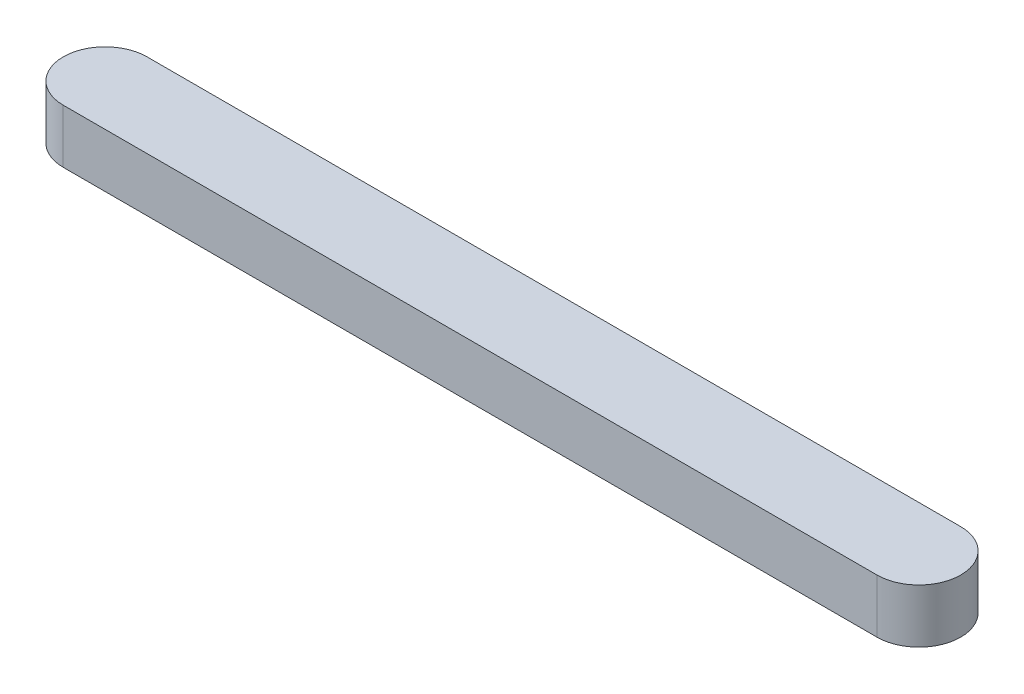
ISO-10303-21;
HEADER;
FILE_DESCRIPTION(('STEP AP214'),'2;1');
FILE_NAME('part.step','',(''),(''),'','','');
FILE_SCHEMA(('AUTOMOTIVE_DESIGN { 1 0 10303 214 1 1 1 1 }'));
ENDSEC;
DATA;
#1=APPLICATION_CONTEXT('core data for automotive mechanical design processes');
#2=APPLICATION_PROTOCOL_DEFINITION('international standard','automotive_design',2000,#1);
#3=PRODUCT_CONTEXT('',#1,'mechanical');
#4=PRODUCT('Part','Part','',(#3));
#5=PRODUCT_RELATED_PRODUCT_CATEGORY('part','',(#4));
#6=PRODUCT_DEFINITION_FORMATION('','',#4);
#7=PRODUCT_DEFINITION_CONTEXT('part definition',#1,'design');
#8=PRODUCT_DEFINITION('design','',#6,#7);
#9=PRODUCT_DEFINITION_SHAPE('','',#8);
#10=(LENGTH_UNIT() NAMED_UNIT(*) SI_UNIT(.MILLI.,.METRE.));
#11=(NAMED_UNIT(*) PLANE_ANGLE_UNIT() SI_UNIT($,.RADIAN.));
#12=(NAMED_UNIT(*) SI_UNIT($,.STERADIAN.) SOLID_ANGLE_UNIT());
#13=UNCERTAINTY_MEASURE_WITH_UNIT(LENGTH_MEASURE(1.E-05),#10,'distance_accuracy_value','');
#14=(GEOMETRIC_REPRESENTATION_CONTEXT(3) GLOBAL_UNCERTAINTY_ASSIGNED_CONTEXT((#13)) GLOBAL_UNIT_ASSIGNED_CONTEXT((#10,
#11,#12)) REPRESENTATION_CONTEXT('',''));
#15=CARTESIAN_POINT('',(0.,0.,0.));
#16=DIRECTION('',(0.,0.,1.));
#17=DIRECTION('',(1.,0.,0.));
#18=AXIS2_PLACEMENT_3D('',#15,#16,#17);
#19=CARTESIAN_POINT('',(-68.,9.,0.));
#20=DIRECTION('',(0.,-1.,0.));
#21=DIRECTION('',(0.,0.,-1.));
#22=AXIS2_PLACEMENT_3D('',#19,#20,#21);
#23=CYLINDRICAL_SURFACE('',#22,7.);
#24=CARTESIAN_POINT('',(-68.,0.,0.));
#25=DIRECTION('',(0.,1.,0.));
#26=DIRECTION('',(0.,0.,1.));
#27=AXIS2_PLACEMENT_3D('',#24,#25,#26);
#28=CIRCLE('',#27,7.);
#29=CARTESIAN_POINT('',(-68.,0.,-7.));
#30=VERTEX_POINT('',#29);
#31=CARTESIAN_POINT('',(-68.,0.,7.));
#32=VERTEX_POINT('',#31);
#33=EDGE_CURVE('E104',#30,#32,#28,.T.);
#34=ORIENTED_EDGE('',*,*,#33,.T.);
#35=DIRECTION('',(0.,-1.,0.));
#36=VECTOR('',#35,1.);
#37=CARTESIAN_POINT('',(-68.,9.,7.));
#38=LINE('',#37,#36);
#39=CARTESIAN_POINT('',(-68.,9.,7.));
#40=VERTEX_POINT('',#39);
#41=EDGE_CURVE('E11',#40,#32,#38,.T.);
#42=ORIENTED_EDGE('',*,*,#41,.F.);
#43=CARTESIAN_POINT('',(-68.,9.,0.));
#44=DIRECTION('',(0.,1.,0.));
#45=DIRECTION('',(0.,0.,1.));
#46=AXIS2_PLACEMENT_3D('',#43,#44,#45);
#47=CIRCLE('',#46,7.);
#48=CARTESIAN_POINT('',(-68.,9.,-7.));
#49=VERTEX_POINT('',#48);
#50=EDGE_CURVE('E92',#49,#40,#47,.T.);
#51=ORIENTED_EDGE('',*,*,#50,.F.);
#52=DIRECTION('',(0.,-1.,0.));
#53=VECTOR('',#52,1.);
#54=CARTESIAN_POINT('',(-68.,9.,-7.));
#55=LINE('',#54,#53);
#56=EDGE_CURVE('E100',#49,#30,#55,.T.);
#57=ORIENTED_EDGE('',*,*,#56,.T.);
#58=EDGE_LOOP('',(#34,#42,#51,#57));
#59=FACE_BOUND('',#58,.T.);
#60=ADVANCED_FACE('F41',(#59),#23,.T.);
#61=CARTESIAN_POINT('',(-68.,9.,7.));
#62=DIRECTION('',(0.,0.,-1.));
#63=DIRECTION('',(-1.,0.,0.));
#64=AXIS2_PLACEMENT_3D('',#61,#62,#63);
#65=PLANE('',#64);
#66=DIRECTION('',(1.,0.,0.));
#67=VECTOR('',#66,1.);
#68=CARTESIAN_POINT('',(-68.,0.,7.));
#69=LINE('',#68,#67);
#70=CARTESIAN_POINT('',(68.,0.,7.));
#71=VERTEX_POINT('',#70);
#72=EDGE_CURVE('E96',#32,#71,#69,.T.);
#73=ORIENTED_EDGE('',*,*,#72,.T.);
#74=DIRECTION('',(0.,-1.,0.));
#75=VECTOR('',#74,1.);
#76=CARTESIAN_POINT('',(68.,9.,7.));
#77=LINE('',#76,#75);
#78=CARTESIAN_POINT('',(68.,9.,7.));
#79=VERTEX_POINT('',#78);
#80=EDGE_CURVE('E49',#79,#71,#77,.T.);
#81=ORIENTED_EDGE('',*,*,#80,.F.);
#82=DIRECTION('',(1.,0.,0.));
#83=VECTOR('',#82,1.);
#84=CARTESIAN_POINT('',(-68.,9.,7.));
#85=LINE('',#84,#83);
#86=EDGE_CURVE('E87',#40,#79,#85,.T.);
#87=ORIENTED_EDGE('',*,*,#86,.F.);
#88=ORIENTED_EDGE('',*,*,#41,.T.);
#89=EDGE_LOOP('',(#73,#81,#87,#88));
#90=FACE_BOUND('',#89,.T.);
#91=ADVANCED_FACE('F95',(#90),#65,.F.);
#92=CARTESIAN_POINT('',(68.,9.,0.));
#93=DIRECTION('',(0.,-1.,0.));
#94=DIRECTION('',(0.,0.,-1.));
#95=AXIS2_PLACEMENT_3D('',#92,#93,#94);
#96=CYLINDRICAL_SURFACE('',#95,7.);
#97=CARTESIAN_POINT('',(68.,0.,0.));
#98=DIRECTION('',(0.,1.,0.));
#99=DIRECTION('',(0.,0.,1.));
#100=AXIS2_PLACEMENT_3D('',#97,#98,#99);
#101=CIRCLE('',#100,7.);
#102=CARTESIAN_POINT('',(68.,0.,-7.));
#103=VERTEX_POINT('',#102);
#104=EDGE_CURVE('E74',#71,#103,#101,.T.);
#105=ORIENTED_EDGE('',*,*,#104,.T.);
#106=DIRECTION('',(0.,-1.,0.));
#107=VECTOR('',#106,1.);
#108=CARTESIAN_POINT('',(68.,9.,-7.));
#109=LINE('',#108,#107);
#110=CARTESIAN_POINT('',(68.,9.,-7.));
#111=VERTEX_POINT('',#110);
#112=EDGE_CURVE('E97',#111,#103,#109,.T.);
#113=ORIENTED_EDGE('',*,*,#112,.F.);
#114=CARTESIAN_POINT('',(68.,9.,0.));
#115=DIRECTION('',(0.,1.,0.));
#116=DIRECTION('',(0.,0.,1.));
#117=AXIS2_PLACEMENT_3D('',#114,#115,#116);
#118=CIRCLE('',#117,7.);
#119=EDGE_CURVE('E90',#79,#111,#118,.T.);
#120=ORIENTED_EDGE('',*,*,#119,.F.);
#121=ORIENTED_EDGE('',*,*,#80,.T.);
#122=EDGE_LOOP('',(#105,#113,#120,#121));
#123=FACE_BOUND('',#122,.T.);
#124=ADVANCED_FACE('F98',(#123),#96,.T.);
#125=CARTESIAN_POINT('',(-68.,9.,-7.));
#126=DIRECTION('',(0.,0.,1.));
#127=DIRECTION('',(1.,0.,0.));
#128=AXIS2_PLACEMENT_3D('',#125,#126,#127);
#129=PLANE('',#128);
#130=DIRECTION('',(-1.,0.,0.));
#131=VECTOR('',#130,1.);
#132=CARTESIAN_POINT('',(-68.,0.,-7.));
#133=LINE('',#132,#131);
#134=EDGE_CURVE('E80',#103,#30,#133,.T.);
#135=ORIENTED_EDGE('',*,*,#134,.T.);
#136=ORIENTED_EDGE('',*,*,#56,.F.);
#137=DIRECTION('',(-1.,0.,0.));
#138=VECTOR('',#137,1.);
#139=CARTESIAN_POINT('',(-68.,9.,-7.));
#140=LINE('',#139,#138);
#141=EDGE_CURVE('E57',#111,#49,#140,.T.);
#142=ORIENTED_EDGE('',*,*,#141,.F.);
#143=ORIENTED_EDGE('',*,*,#112,.T.);
#144=EDGE_LOOP('',(#135,#136,#142,#143));
#145=FACE_BOUND('',#144,.T.);
#146=ADVANCED_FACE('F111',(#145),#129,.F.);
#147=CARTESIAN_POINT('',(-68.,9.,0.));
#148=DIRECTION('',(0.,1.,0.));
#149=DIRECTION('',(0.,0.,1.));
#150=AXIS2_PLACEMENT_3D('',#147,#148,#149);
#151=PLANE('',#150);
#152=ORIENTED_EDGE('',*,*,#50,.T.);
#153=ORIENTED_EDGE('',*,*,#86,.T.);
#154=ORIENTED_EDGE('',*,*,#119,.T.);
#155=ORIENTED_EDGE('',*,*,#141,.T.);
#156=EDGE_LOOP('',(#152,#153,#154,#155));
#157=FACE_BOUND('',#156,.T.);
#158=ADVANCED_FACE('F88',(#157),#151,.T.);
#159=CARTESIAN_POINT('',(-68.,0.,0.));
#160=DIRECTION('',(0.,1.,0.));
#161=DIRECTION('',(0.,0.,1.));
#162=AXIS2_PLACEMENT_3D('',#159,#160,#161);
#163=PLANE('',#162);
#164=ORIENTED_EDGE('',*,*,#33,.F.);
#165=ORIENTED_EDGE('',*,*,#134,.F.);
#166=ORIENTED_EDGE('',*,*,#104,.F.);
#167=ORIENTED_EDGE('',*,*,#72,.F.);
#168=EDGE_LOOP('',(#164,#165,#166,#167));
#169=FACE_BOUND('',#168,.T.);
#170=ADVANCED_FACE('F114',(#169),#163,.F.);
#171=CLOSED_SHELL('',(#60,#91,#124,#146,#158,#170));
#172=MANIFOLD_SOLID_BREP('B2',#171);
#173=ADVANCED_BREP_SHAPE_REPRESENTATION('',(#18,#172),#14);
#174=SHAPE_DEFINITION_REPRESENTATION(#9,#173);
ENDSEC;
END-ISO-10303-21;
